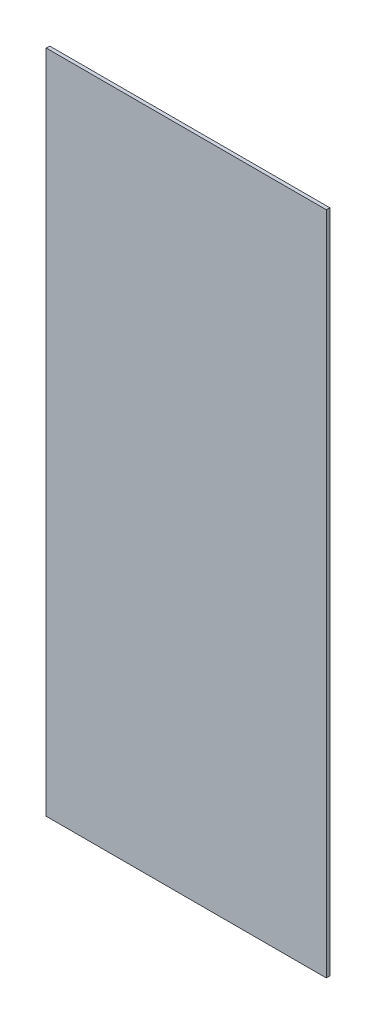
ISO-10303-21;
HEADER;
FILE_DESCRIPTION(('STEP AP214'),'2;1');
FILE_NAME('part.step','',(''),(''),'','','');
FILE_SCHEMA(('AUTOMOTIVE_DESIGN { 1 0 10303 214 1 1 1 1 }'));
ENDSEC;
DATA;
#1=APPLICATION_CONTEXT('core data for automotive mechanical design processes');
#2=APPLICATION_PROTOCOL_DEFINITION('international standard','automotive_design',2000,#1);
#3=PRODUCT_CONTEXT('',#1,'mechanical');
#4=PRODUCT('Part','Part','',(#3));
#5=PRODUCT_RELATED_PRODUCT_CATEGORY('part','',(#4));
#6=PRODUCT_DEFINITION_FORMATION('','',#4);
#7=PRODUCT_DEFINITION_CONTEXT('part definition',#1,'design');
#8=PRODUCT_DEFINITION('design','',#6,#7);
#9=PRODUCT_DEFINITION_SHAPE('','',#8);
#10=(LENGTH_UNIT() NAMED_UNIT(*) SI_UNIT(.MILLI.,.METRE.));
#11=(NAMED_UNIT(*) PLANE_ANGLE_UNIT() SI_UNIT($,.RADIAN.));
#12=(NAMED_UNIT(*) SI_UNIT($,.STERADIAN.) SOLID_ANGLE_UNIT());
#13=UNCERTAINTY_MEASURE_WITH_UNIT(LENGTH_MEASURE(1.E-05),#10,'distance_accuracy_value','');
#14=(GEOMETRIC_REPRESENTATION_CONTEXT(3) GLOBAL_UNCERTAINTY_ASSIGNED_CONTEXT((#13)) GLOBAL_UNIT_ASSIGNED_CONTEXT((#10,
#11,#12)) REPRESENTATION_CONTEXT('',''));
#15=CARTESIAN_POINT('',(0.,0.,0.));
#16=DIRECTION('',(0.,0.,1.));
#17=DIRECTION('',(1.,0.,0.));
#18=AXIS2_PLACEMENT_3D('',#15,#16,#17);
#19=CARTESIAN_POINT('',(0.,0.,0.5));
#20=DIRECTION('',(1.,0.,0.));
#21=DIRECTION('',(0.,0.,-1.));
#22=AXIS2_PLACEMENT_3D('',#19,#20,#21);
#23=PLANE('',#22);
#24=DIRECTION('',(0.,-1.,0.));
#25=VECTOR('',#24,1.);
#26=CARTESIAN_POINT('',(0.,0.,0.));
#27=LINE('',#26,#25);
#28=CARTESIAN_POINT('',(0.,95.,0.));
#29=VERTEX_POINT('',#28);
#30=CARTESIAN_POINT('',(0.,0.,0.));
#31=VERTEX_POINT('',#30);
#32=EDGE_CURVE('E96',#29,#31,#27,.T.);
#33=ORIENTED_EDGE('',*,*,#32,.T.);
#34=DIRECTION('',(0.,0.,-1.));
#35=VECTOR('',#34,1.);
#36=CARTESIAN_POINT('',(0.,0.,0.5));
#37=LINE('',#36,#35);
#38=CARTESIAN_POINT('',(0.,0.,0.5));
#39=VERTEX_POINT('',#38);
#40=EDGE_CURVE('E11',#39,#31,#37,.T.);
#41=ORIENTED_EDGE('',*,*,#40,.F.);
#42=DIRECTION('',(0.,-1.,0.));
#43=VECTOR('',#42,1.);
#44=CARTESIAN_POINT('',(0.,0.,0.5));
#45=LINE('',#44,#43);
#46=CARTESIAN_POINT('',(0.,95.,0.5));
#47=VERTEX_POINT('',#46);
#48=EDGE_CURVE('E84',#47,#39,#45,.T.);
#49=ORIENTED_EDGE('',*,*,#48,.F.);
#50=DIRECTION('',(0.,0.,-1.));
#51=VECTOR('',#50,1.);
#52=CARTESIAN_POINT('',(0.,95.,0.5));
#53=LINE('',#52,#51);
#54=EDGE_CURVE('E92',#47,#29,#53,.T.);
#55=ORIENTED_EDGE('',*,*,#54,.T.);
#56=EDGE_LOOP('',(#33,#41,#49,#55));
#57=FACE_BOUND('',#56,.T.);
#58=ADVANCED_FACE('F33',(#57),#23,.F.);
#59=CARTESIAN_POINT('',(0.,0.,0.5));
#60=DIRECTION('',(0.,1.,0.));
#61=DIRECTION('',(0.,0.,1.));
#62=AXIS2_PLACEMENT_3D('',#59,#60,#61);
#63=PLANE('',#62);
#64=DIRECTION('',(1.,0.,0.));
#65=VECTOR('',#64,1.);
#66=CARTESIAN_POINT('',(0.,0.,0.));
#67=LINE('',#66,#65);
#68=CARTESIAN_POINT('',(40.,0.,0.));
#69=VERTEX_POINT('',#68);
#70=EDGE_CURVE('E88',#31,#69,#67,.T.);
#71=ORIENTED_EDGE('',*,*,#70,.T.);
#72=DIRECTION('',(0.,0.,-1.));
#73=VECTOR('',#72,1.);
#74=CARTESIAN_POINT('',(40.,0.,0.5));
#75=LINE('',#74,#73);
#76=CARTESIAN_POINT('',(40.,0.,0.5));
#77=VERTEX_POINT('',#76);
#78=EDGE_CURVE('E41',#77,#69,#75,.T.);
#79=ORIENTED_EDGE('',*,*,#78,.F.);
#80=DIRECTION('',(1.,0.,0.));
#81=VECTOR('',#80,1.);
#82=CARTESIAN_POINT('',(0.,0.,0.5));
#83=LINE('',#82,#81);
#84=EDGE_CURVE('E79',#39,#77,#83,.T.);
#85=ORIENTED_EDGE('',*,*,#84,.F.);
#86=ORIENTED_EDGE('',*,*,#40,.T.);
#87=EDGE_LOOP('',(#71,#79,#85,#86));
#88=FACE_BOUND('',#87,.T.);
#89=ADVANCED_FACE('F87',(#88),#63,.F.);
#90=CARTESIAN_POINT('',(40.,0.,0.5));
#91=DIRECTION('',(-1.,0.,0.));
#92=DIRECTION('',(0.,0.,1.));
#93=AXIS2_PLACEMENT_3D('',#90,#91,#92);
#94=PLANE('',#93);
#95=DIRECTION('',(0.,1.,0.));
#96=VECTOR('',#95,1.);
#97=CARTESIAN_POINT('',(40.,0.,0.));
#98=LINE('',#97,#96);
#99=CARTESIAN_POINT('',(40.,95.,0.));
#100=VERTEX_POINT('',#99);
#101=EDGE_CURVE('E66',#69,#100,#98,.T.);
#102=ORIENTED_EDGE('',*,*,#101,.T.);
#103=DIRECTION('',(0.,0.,-1.));
#104=VECTOR('',#103,1.);
#105=CARTESIAN_POINT('',(40.,95.,0.5));
#106=LINE('',#105,#104);
#107=CARTESIAN_POINT('',(40.,95.,0.5));
#108=VERTEX_POINT('',#107);
#109=EDGE_CURVE('E89',#108,#100,#106,.T.);
#110=ORIENTED_EDGE('',*,*,#109,.F.);
#111=DIRECTION('',(0.,1.,0.));
#112=VECTOR('',#111,1.);
#113=CARTESIAN_POINT('',(40.,0.,0.5));
#114=LINE('',#113,#112);
#115=EDGE_CURVE('E82',#77,#108,#114,.T.);
#116=ORIENTED_EDGE('',*,*,#115,.F.);
#117=ORIENTED_EDGE('',*,*,#78,.T.);
#118=EDGE_LOOP('',(#102,#110,#116,#117));
#119=FACE_BOUND('',#118,.T.);
#120=ADVANCED_FACE('F90',(#119),#94,.F.);
#121=CARTESIAN_POINT('',(0.,95.,0.5));
#122=DIRECTION('',(0.,-1.,0.));
#123=DIRECTION('',(0.,0.,-1.));
#124=AXIS2_PLACEMENT_3D('',#121,#122,#123);
#125=PLANE('',#124);
#126=DIRECTION('',(-1.,0.,0.));
#127=VECTOR('',#126,1.);
#128=CARTESIAN_POINT('',(0.,95.,0.));
#129=LINE('',#128,#127);
#130=EDGE_CURVE('E72',#100,#29,#129,.T.);
#131=ORIENTED_EDGE('',*,*,#130,.T.);
#132=ORIENTED_EDGE('',*,*,#54,.F.);
#133=DIRECTION('',(-1.,0.,0.));
#134=VECTOR('',#133,1.);
#135=CARTESIAN_POINT('',(0.,95.,0.5));
#136=LINE('',#135,#134);
#137=EDGE_CURVE('E49',#108,#47,#136,.T.);
#138=ORIENTED_EDGE('',*,*,#137,.F.);
#139=ORIENTED_EDGE('',*,*,#109,.T.);
#140=EDGE_LOOP('',(#131,#132,#138,#139));
#141=FACE_BOUND('',#140,.T.);
#142=ADVANCED_FACE('F103',(#141),#125,.F.);
#143=CARTESIAN_POINT('',(0.,0.,0.5));
#144=DIRECTION('',(0.,0.,-1.));
#145=DIRECTION('',(-1.,0.,0.));
#146=AXIS2_PLACEMENT_3D('',#143,#144,#145);
#147=PLANE('',#146);
#148=ORIENTED_EDGE('',*,*,#48,.T.);
#149=ORIENTED_EDGE('',*,*,#84,.T.);
#150=ORIENTED_EDGE('',*,*,#115,.T.);
#151=ORIENTED_EDGE('',*,*,#137,.T.);
#152=EDGE_LOOP('',(#148,#149,#150,#151));
#153=FACE_BOUND('',#152,.T.);
#154=ADVANCED_FACE('F80',(#153),#147,.F.);
#155=CARTESIAN_POINT('',(0.,0.,0.));
#156=DIRECTION('',(0.,0.,-1.));
#157=DIRECTION('',(-1.,0.,0.));
#158=AXIS2_PLACEMENT_3D('',#155,#156,#157);
#159=PLANE('',#158);
#160=ORIENTED_EDGE('',*,*,#32,.F.);
#161=ORIENTED_EDGE('',*,*,#130,.F.);
#162=ORIENTED_EDGE('',*,*,#101,.F.);
#163=ORIENTED_EDGE('',*,*,#70,.F.);
#164=EDGE_LOOP('',(#160,#161,#162,#163));
#165=FACE_BOUND('',#164,.T.);
#166=ADVANCED_FACE('F106',(#165),#159,.T.);
#167=CLOSED_SHELL('',(#58,#89,#120,#142,#154,#166));
#168=MANIFOLD_SOLID_BREP('B2',#167);
#169=ADVANCED_BREP_SHAPE_REPRESENTATION('',(#18,#168),#14);
#170=SHAPE_DEFINITION_REPRESENTATION(#9,#169);
ENDSEC;
END-ISO-10303-21;
